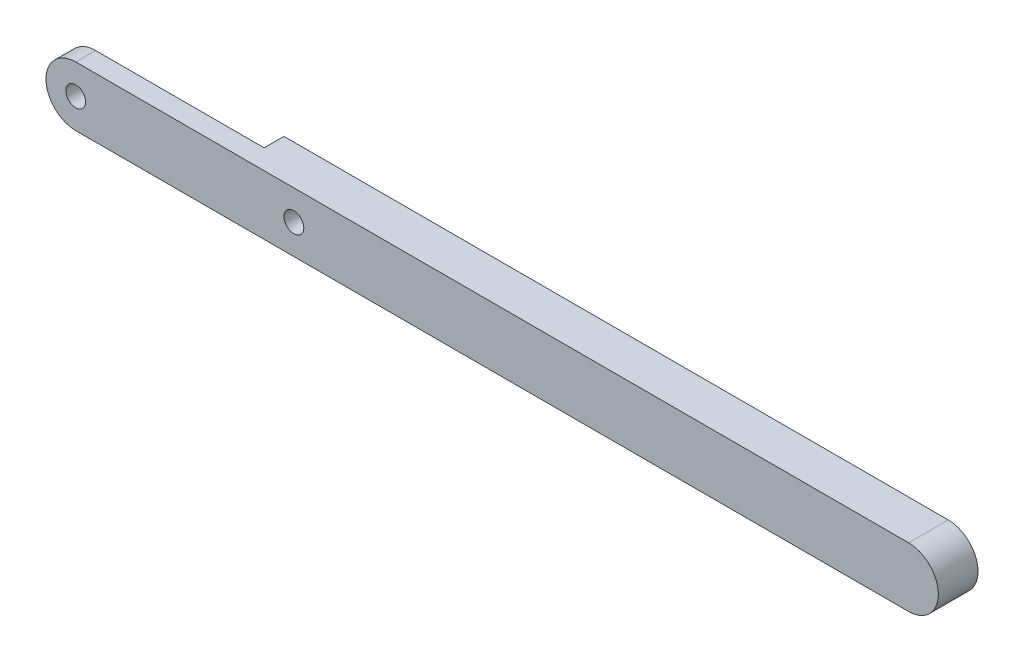
ISO-10303-21;
HEADER;
FILE_DESCRIPTION(('STEP AP214'),'2;1');
FILE_NAME('part.step','',(''),(''),'','','');
FILE_SCHEMA(('AUTOMOTIVE_DESIGN { 1 0 10303 214 1 1 1 1 }'));
ENDSEC;
DATA;
#1=APPLICATION_CONTEXT('core data for automotive mechanical design processes');
#2=APPLICATION_PROTOCOL_DEFINITION('international standard','automotive_design',2000,#1);
#3=PRODUCT_CONTEXT('',#1,'mechanical');
#4=PRODUCT('Part','Part','',(#3));
#5=PRODUCT_RELATED_PRODUCT_CATEGORY('part','',(#4));
#6=PRODUCT_DEFINITION_FORMATION('','',#4);
#7=PRODUCT_DEFINITION_CONTEXT('part definition',#1,'design');
#8=PRODUCT_DEFINITION('design','',#6,#7);
#9=PRODUCT_DEFINITION_SHAPE('','',#8);
#10=(LENGTH_UNIT() NAMED_UNIT(*) SI_UNIT(.MILLI.,.METRE.));
#11=(NAMED_UNIT(*) PLANE_ANGLE_UNIT() SI_UNIT($,.RADIAN.));
#12=(NAMED_UNIT(*) SI_UNIT($,.STERADIAN.) SOLID_ANGLE_UNIT());
#13=UNCERTAINTY_MEASURE_WITH_UNIT(LENGTH_MEASURE(1.E-05),#10,'distance_accuracy_value','');
#14=(GEOMETRIC_REPRESENTATION_CONTEXT(3) GLOBAL_UNCERTAINTY_ASSIGNED_CONTEXT((#13)) GLOBAL_UNIT_ASSIGNED_CONTEXT((#10,
#11,#12)) REPRESENTATION_CONTEXT('',''));
#15=CARTESIAN_POINT('',(0.,0.,0.));
#16=DIRECTION('',(0.,0.,1.));
#17=DIRECTION('',(1.,0.,0.));
#18=AXIS2_PLACEMENT_3D('',#15,#16,#17);
#19=CARTESIAN_POINT('',(0.,0.,10.));
#20=DIRECTION('',(0.,0.,-1.));
#21=DIRECTION('',(-1.,0.,0.));
#22=AXIS2_PLACEMENT_3D('',#19,#20,#21);
#23=CYLINDRICAL_SURFACE('',#22,15.);
#24=CARTESIAN_POINT('',(0.,0.,0.));
#25=DIRECTION('',(0.,0.,-1.));
#26=DIRECTION('',(-1.,0.,0.));
#27=AXIS2_PLACEMENT_3D('',#24,#25,#26);
#28=CIRCLE('',#27,15.);
#29=CARTESIAN_POINT('',(0.,-15.,0.));
#30=VERTEX_POINT('',#29);
#31=CARTESIAN_POINT('',(0.,15.,0.));
#32=VERTEX_POINT('',#31);
#33=EDGE_CURVE('E48',#30,#32,#28,.T.);
#34=ORIENTED_EDGE('',*,*,#33,.F.);
#35=DIRECTION('',(0.,0.,-1.));
#36=VECTOR('',#35,1.);
#37=CARTESIAN_POINT('',(0.,-15.,10.));
#38=LINE('',#37,#36);
#39=CARTESIAN_POINT('',(0.,-15.,10.));
#40=VERTEX_POINT('',#39);
#41=EDGE_CURVE('E11',#40,#30,#38,.T.);
#42=ORIENTED_EDGE('',*,*,#41,.F.);
#43=CARTESIAN_POINT('',(0.,0.,10.));
#44=DIRECTION('',(0.,0.,1.));
#45=DIRECTION('',(1.,0.,0.));
#46=AXIS2_PLACEMENT_3D('',#43,#44,#45);
#47=CIRCLE('',#46,15.);
#48=CARTESIAN_POINT('',(0.,15.,10.));
#49=VERTEX_POINT('',#48);
#50=EDGE_CURVE('E118',#49,#40,#47,.T.);
#51=ORIENTED_EDGE('',*,*,#50,.F.);
#52=DIRECTION('',(0.,0.,-1.));
#53=VECTOR('',#52,1.);
#54=CARTESIAN_POINT('',(0.,15.,10.));
#55=LINE('',#54,#53);
#56=EDGE_CURVE('E124',#49,#32,#55,.T.);
#57=ORIENTED_EDGE('',*,*,#56,.T.);
#58=EDGE_LOOP('',(#34,#42,#51,#57));
#59=FACE_BOUND('',#58,.T.);
#60=ADVANCED_FACE('F33',(#59),#23,.T.);
#61=CARTESIAN_POINT('',(0.,0.,10.));
#62=DIRECTION('',(0.,0.,-1.));
#63=DIRECTION('',(-1.,0.,0.));
#64=AXIS2_PLACEMENT_3D('',#61,#62,#63);
#65=CYLINDRICAL_SURFACE('',#64,5.);
#66=CARTESIAN_POINT('',(0.,0.,10.));
#67=DIRECTION('',(0.,0.,1.));
#68=DIRECTION('',(1.,0.,0.));
#69=AXIS2_PLACEMENT_3D('',#66,#67,#68);
#70=CIRCLE('',#69,5.);
#71=CARTESIAN_POINT('',(5.,0.,10.));
#72=VERTEX_POINT('',#71);
#73=EDGE_CURVE('E133',#72,#72,#70,.T.);
#74=ORIENTED_EDGE('',*,*,#73,.T.);
#75=EDGE_LOOP('',(#74));
#76=FACE_BOUND('',#75,.T.);
#77=CARTESIAN_POINT('',(0.,0.,0.));
#78=DIRECTION('',(0.,0.,-1.));
#79=DIRECTION('',(-1.,0.,0.));
#80=AXIS2_PLACEMENT_3D('',#77,#78,#79);
#81=CIRCLE('',#80,5.);
#82=CARTESIAN_POINT('',(-5.,0.,0.));
#83=VERTEX_POINT('',#82);
#84=EDGE_CURVE('E36',#83,#83,#81,.T.);
#85=ORIENTED_EDGE('',*,*,#84,.T.);
#86=EDGE_LOOP('',(#85));
#87=FACE_BOUND('',#86,.T.);
#88=ADVANCED_FACE('F157',(#76,#87),#65,.F.);
#89=CARTESIAN_POINT('',(0.,0.,10.));
#90=DIRECTION('',(0.,0.,1.));
#91=DIRECTION('',(1.,0.,0.));
#92=AXIS2_PLACEMENT_3D('',#89,#90,#91);
#93=PLANE('',#92);
#94=ORIENTED_EDGE('',*,*,#73,.F.);
#95=EDGE_LOOP('',(#94));
#96=FACE_BOUND('',#95,.T.);
#97=ORIENTED_EDGE('',*,*,#50,.T.);
#98=DIRECTION('',(1.,0.,0.));
#99=VECTOR('',#98,1.);
#100=CARTESIAN_POINT('',(0.,-15.,10.));
#101=LINE('',#100,#99);
#102=CARTESIAN_POINT('',(420.,-15.,10.));
#103=VERTEX_POINT('',#102);
#104=EDGE_CURVE('E80',#40,#103,#101,.T.);
#105=ORIENTED_EDGE('',*,*,#104,.T.);
#106=CARTESIAN_POINT('',(420.,0.,10.));
#107=DIRECTION('',(0.,0.,1.));
#108=DIRECTION('',(1.,0.,0.));
#109=AXIS2_PLACEMENT_3D('',#106,#107,#108);
#110=CIRCLE('',#109,15.);
#111=CARTESIAN_POINT('',(420.,15.,10.));
#112=VERTEX_POINT('',#111);
#113=EDGE_CURVE('E130',#103,#112,#110,.T.);
#114=ORIENTED_EDGE('',*,*,#113,.T.);
#115=DIRECTION('',(-1.,0.,0.));
#116=VECTOR('',#115,1.);
#117=CARTESIAN_POINT('',(0.,15.,10.));
#118=LINE('',#117,#116);
#119=EDGE_CURVE('E57',#112,#49,#118,.T.);
#120=ORIENTED_EDGE('',*,*,#119,.T.);
#121=EDGE_LOOP('',(#97,#105,#114,#120));
#122=FACE_BOUND('',#121,.T.);
#123=CARTESIAN_POINT('',(110.,0.,10.));
#124=DIRECTION('',(0.,0.,1.));
#125=DIRECTION('',(1.,0.,0.));
#126=AXIS2_PLACEMENT_3D('',#123,#124,#125);
#127=CIRCLE('',#126,5.);
#128=CARTESIAN_POINT('',(115.,0.,10.));
#129=VERTEX_POINT('',#128);
#130=EDGE_CURVE('E135',#129,#129,#127,.T.);
#131=ORIENTED_EDGE('',*,*,#130,.F.);
#132=EDGE_LOOP('',(#131));
#133=FACE_BOUND('',#132,.T.);
#134=ADVANCED_FACE('F154',(#96,#122,#133),#93,.T.);
#135=CARTESIAN_POINT('',(0.,0.,-10.));
#136=DIRECTION('',(0.,0.,1.));
#137=DIRECTION('',(1.,0.,0.));
#138=AXIS2_PLACEMENT_3D('',#135,#136,#137);
#139=PLANE('',#138);
#140=DIRECTION('',(1.,0.,0.));
#141=VECTOR('',#140,1.);
#142=CARTESIAN_POINT('',(0.,-15.,-10.));
#143=LINE('',#142,#141);
#144=CARTESIAN_POINT('',(85.,-15.,-10.));
#145=VERTEX_POINT('',#144);
#146=CARTESIAN_POINT('',(420.,-15.,-10.));
#147=VERTEX_POINT('',#146);
#148=EDGE_CURVE('E113',#145,#147,#143,.T.);
#149=ORIENTED_EDGE('',*,*,#148,.F.);
#150=DIRECTION('',(0.,1.,0.));
#151=VECTOR('',#150,1.);
#152=CARTESIAN_POINT('',(85.,15.,-10.));
#153=LINE('',#152,#151);
#154=CARTESIAN_POINT('',(85.,15.,-10.));
#155=VERTEX_POINT('',#154);
#156=EDGE_CURVE('E99',#145,#155,#153,.T.);
#157=ORIENTED_EDGE('',*,*,#156,.T.);
#158=DIRECTION('',(-1.,0.,0.));
#159=VECTOR('',#158,1.);
#160=CARTESIAN_POINT('',(0.,15.,-10.));
#161=LINE('',#160,#159);
#162=CARTESIAN_POINT('',(420.,15.,-10.));
#163=VERTEX_POINT('',#162);
#164=EDGE_CURVE('E112',#163,#155,#161,.T.);
#165=ORIENTED_EDGE('',*,*,#164,.F.);
#166=CARTESIAN_POINT('',(420.,0.,-10.));
#167=DIRECTION('',(0.,0.,1.));
#168=DIRECTION('',(1.,0.,0.));
#169=AXIS2_PLACEMENT_3D('',#166,#167,#168);
#170=CIRCLE('',#169,15.);
#171=EDGE_CURVE('E73',#147,#163,#170,.T.);
#172=ORIENTED_EDGE('',*,*,#171,.F.);
#173=EDGE_LOOP('',(#149,#157,#165,#172));
#174=FACE_BOUND('',#173,.T.);
#175=CARTESIAN_POINT('',(110.,0.,-10.));
#176=DIRECTION('',(0.,0.,1.));
#177=DIRECTION('',(1.,0.,0.));
#178=AXIS2_PLACEMENT_3D('',#175,#176,#177);
#179=CIRCLE('',#178,5.);
#180=CARTESIAN_POINT('',(115.,0.,-10.));
#181=VERTEX_POINT('',#180);
#182=EDGE_CURVE('E141',#181,#181,#179,.T.);
#183=ORIENTED_EDGE('',*,*,#182,.T.);
#184=EDGE_LOOP('',(#183));
#185=FACE_BOUND('',#184,.T.);
#186=ADVANCED_FACE('F110',(#174,#185),#139,.F.);
#187=CARTESIAN_POINT('',(0.,-15.,10.));
#188=DIRECTION('',(0.,1.,0.));
#189=DIRECTION('',(0.,0.,1.));
#190=AXIS2_PLACEMENT_3D('',#187,#188,#189);
#191=PLANE('',#190);
#192=DIRECTION('',(1.,0.,0.));
#193=VECTOR('',#192,1.);
#194=CARTESIAN_POINT('',(85.,-15.,0.));
#195=LINE('',#194,#193);
#196=CARTESIAN_POINT('',(85.,-15.,0.));
#197=VERTEX_POINT('',#196);
#198=EDGE_CURVE('E114',#30,#197,#195,.T.);
#199=ORIENTED_EDGE('',*,*,#198,.T.);
#200=DIRECTION('',(0.,0.,1.));
#201=VECTOR('',#200,1.);
#202=CARTESIAN_POINT('',(85.,-15.,-10.));
#203=LINE('',#202,#201);
#204=EDGE_CURVE('E105',#145,#197,#203,.T.);
#205=ORIENTED_EDGE('',*,*,#204,.F.);
#206=ORIENTED_EDGE('',*,*,#148,.T.);
#207=DIRECTION('',(0.,0.,-1.));
#208=VECTOR('',#207,1.);
#209=CARTESIAN_POINT('',(420.,-15.,10.));
#210=LINE('',#209,#208);
#211=EDGE_CURVE('E41',#103,#147,#210,.T.);
#212=ORIENTED_EDGE('',*,*,#211,.F.);
#213=ORIENTED_EDGE('',*,*,#104,.F.);
#214=ORIENTED_EDGE('',*,*,#41,.T.);
#215=EDGE_LOOP('',(#199,#205,#206,#212,#213,#214));
#216=FACE_BOUND('',#215,.T.);
#217=ADVANCED_FACE('F132',(#216),#191,.F.);
#218=CARTESIAN_POINT('',(420.,0.,10.));
#219=DIRECTION('',(0.,0.,-1.));
#220=DIRECTION('',(-1.,0.,0.));
#221=AXIS2_PLACEMENT_3D('',#218,#219,#220);
#222=CYLINDRICAL_SURFACE('',#221,15.);
#223=ORIENTED_EDGE('',*,*,#171,.T.);
#224=DIRECTION('',(0.,0.,-1.));
#225=VECTOR('',#224,1.);
#226=CARTESIAN_POINT('',(420.,15.,10.));
#227=LINE('',#226,#225);
#228=EDGE_CURVE('E117',#112,#163,#227,.T.);
#229=ORIENTED_EDGE('',*,*,#228,.F.);
#230=ORIENTED_EDGE('',*,*,#113,.F.);
#231=ORIENTED_EDGE('',*,*,#211,.T.);
#232=EDGE_LOOP('',(#223,#229,#230,#231));
#233=FACE_BOUND('',#232,.T.);
#234=ADVANCED_FACE('F129',(#233),#222,.T.);
#235=CARTESIAN_POINT('',(0.,15.,10.));
#236=DIRECTION('',(0.,-1.,0.));
#237=DIRECTION('',(0.,0.,-1.));
#238=AXIS2_PLACEMENT_3D('',#235,#236,#237);
#239=PLANE('',#238);
#240=ORIENTED_EDGE('',*,*,#164,.T.);
#241=DIRECTION('',(0.,0.,1.));
#242=VECTOR('',#241,1.);
#243=CARTESIAN_POINT('',(85.,15.,-10.));
#244=LINE('',#243,#242);
#245=CARTESIAN_POINT('',(85.,15.,0.));
#246=VERTEX_POINT('',#245);
#247=EDGE_CURVE('E96',#155,#246,#244,.T.);
#248=ORIENTED_EDGE('',*,*,#247,.T.);
#249=DIRECTION('',(-1.,0.,0.));
#250=VECTOR('',#249,1.);
#251=CARTESIAN_POINT('',(85.,15.,0.));
#252=LINE('',#251,#250);
#253=EDGE_CURVE('E149',#246,#32,#252,.T.);
#254=ORIENTED_EDGE('',*,*,#253,.T.);
#255=ORIENTED_EDGE('',*,*,#56,.F.);
#256=ORIENTED_EDGE('',*,*,#119,.F.);
#257=ORIENTED_EDGE('',*,*,#228,.T.);
#258=EDGE_LOOP('',(#240,#248,#254,#255,#256,#257));
#259=FACE_BOUND('',#258,.T.);
#260=ADVANCED_FACE('F116',(#259),#239,.F.);
#261=CARTESIAN_POINT('',(110.,0.,10.));
#262=DIRECTION('',(0.,0.,-1.));
#263=DIRECTION('',(-1.,0.,0.));
#264=AXIS2_PLACEMENT_3D('',#261,#262,#263);
#265=CYLINDRICAL_SURFACE('',#264,5.);
#266=ORIENTED_EDGE('',*,*,#130,.T.);
#267=EDGE_LOOP('',(#266));
#268=FACE_BOUND('',#267,.T.);
#269=ORIENTED_EDGE('',*,*,#182,.F.);
#270=EDGE_LOOP('',(#269));
#271=FACE_BOUND('',#270,.T.);
#272=ADVANCED_FACE('F162',(#268,#271),#265,.F.);
#273=CARTESIAN_POINT('',(0.,0.,0.));
#274=DIRECTION('',(0.,0.,-1.));
#275=DIRECTION('',(-1.,0.,0.));
#276=AXIS2_PLACEMENT_3D('',#273,#274,#275);
#277=PLANE('',#276);
#278=ORIENTED_EDGE('',*,*,#84,.F.);
#279=EDGE_LOOP('',(#278));
#280=FACE_BOUND('',#279,.T.);
#281=ORIENTED_EDGE('',*,*,#33,.T.);
#282=ORIENTED_EDGE('',*,*,#253,.F.);
#283=DIRECTION('',(0.,1.,0.));
#284=VECTOR('',#283,1.);
#285=CARTESIAN_POINT('',(85.,15.,0.));
#286=LINE('',#285,#284);
#287=EDGE_CURVE('E102',#197,#246,#286,.T.);
#288=ORIENTED_EDGE('',*,*,#287,.F.);
#289=ORIENTED_EDGE('',*,*,#198,.F.);
#290=EDGE_LOOP('',(#281,#282,#288,#289));
#291=FACE_BOUND('',#290,.T.);
#292=ADVANCED_FACE('F165',(#280,#291),#277,.T.);
#293=CARTESIAN_POINT('',(85.,15.,-10.));
#294=DIRECTION('',(1.,0.,0.));
#295=DIRECTION('',(0.,0.,-1.));
#296=AXIS2_PLACEMENT_3D('',#293,#294,#295);
#297=PLANE('',#296);
#298=ORIENTED_EDGE('',*,*,#287,.T.);
#299=ORIENTED_EDGE('',*,*,#247,.F.);
#300=ORIENTED_EDGE('',*,*,#156,.F.);
#301=ORIENTED_EDGE('',*,*,#204,.T.);
#302=EDGE_LOOP('',(#298,#299,#300,#301));
#303=FACE_BOUND('',#302,.T.);
#304=ADVANCED_FACE('F98',(#303),#297,.F.);
#305=CLOSED_SHELL('',(#60,#88,#134,#186,#217,#234,#260,#272,#292,#304));
#306=MANIFOLD_SOLID_BREP('B2',#305);
#307=ADVANCED_BREP_SHAPE_REPRESENTATION('',(#18,#306),#14);
#308=SHAPE_DEFINITION_REPRESENTATION(#9,#307);
ENDSEC;
END-ISO-10303-21;
